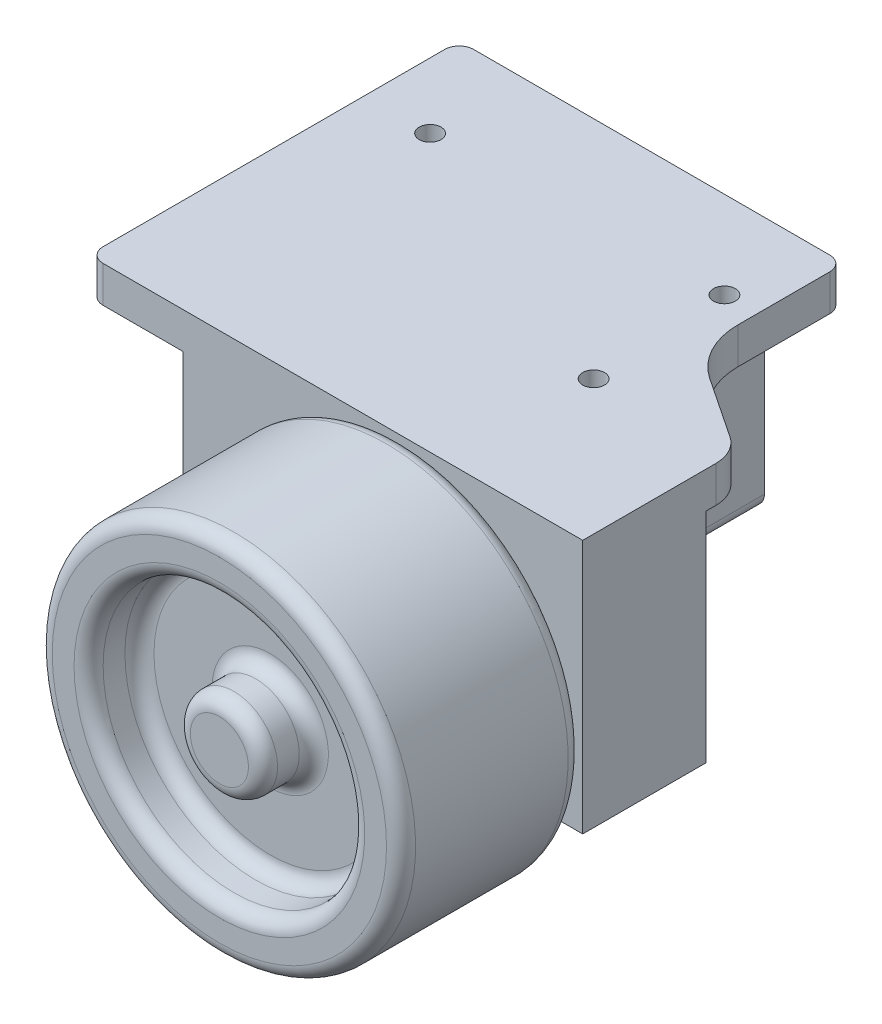
ISO-10303-21;
HEADER;
FILE_DESCRIPTION(('STEP AP214'),'2;1');
FILE_NAME('part.step','',(''),(''),'','','');
FILE_SCHEMA(('AUTOMOTIVE_DESIGN { 1 0 10303 214 1 1 1 1 }'));
ENDSEC;
DATA;
#1=APPLICATION_CONTEXT('core data for automotive mechanical design processes');
#2=APPLICATION_PROTOCOL_DEFINITION('international standard','automotive_design',2000,#1);
#3=PRODUCT_CONTEXT('',#1,'mechanical');
#4=PRODUCT('Part','Part','',(#3));
#5=PRODUCT_RELATED_PRODUCT_CATEGORY('part','',(#4));
#6=PRODUCT_DEFINITION_FORMATION('','',#4);
#7=PRODUCT_DEFINITION_CONTEXT('part definition',#1,'design');
#8=PRODUCT_DEFINITION('design','',#6,#7);
#9=PRODUCT_DEFINITION_SHAPE('','',#8);
#10=(LENGTH_UNIT() NAMED_UNIT(*) SI_UNIT(.MILLI.,.METRE.));
#11=(NAMED_UNIT(*) PLANE_ANGLE_UNIT() SI_UNIT($,.RADIAN.));
#12=(NAMED_UNIT(*) SI_UNIT($,.STERADIAN.) SOLID_ANGLE_UNIT());
#13=UNCERTAINTY_MEASURE_WITH_UNIT(LENGTH_MEASURE(1.E-05),#10,'distance_accuracy_value','');
#14=(GEOMETRIC_REPRESENTATION_CONTEXT(3) GLOBAL_UNCERTAINTY_ASSIGNED_CONTEXT((#13)) GLOBAL_UNIT_ASSIGNED_CONTEXT((#10,
#11,#12)) REPRESENTATION_CONTEXT('',''));
#15=CARTESIAN_POINT('',(0.,0.,0.));
#16=DIRECTION('',(0.,0.,1.));
#17=DIRECTION('',(1.,0.,0.));
#18=AXIS2_PLACEMENT_3D('',#15,#16,#17);
#19=CARTESIAN_POINT('',(0.,0.,-51.));
#20=DIRECTION('',(1.,0.,0.));
#21=DIRECTION('',(0.,0.,1.));
#22=AXIS2_PLACEMENT_3D('',#19,#20,#21);
#23=PLANE('',#22);
#24=DIRECTION('',(0.,0.,1.));
#25=VECTOR('',#24,1.);
#26=CARTESIAN_POINT('',(0.,30.,-51.));
#27=LINE('',#26,#25);
#28=CARTESIAN_POINT('',(0.,30.,-49.));
#29=VERTEX_POINT('',#28);
#30=CARTESIAN_POINT('',(0.,30.,-2.));
#31=VERTEX_POINT('',#30);
#32=EDGE_CURVE('E202',#29,#31,#27,.T.);
#33=ORIENTED_EDGE('',*,*,#32,.T.);
#34=DIRECTION('',(0.,-1.,0.));
#35=VECTOR('',#34,1.);
#36=CARTESIAN_POINT('',(0.,30.,-2.));
#37=LINE('',#36,#35);
#38=CARTESIAN_POINT('',(0.,35.,-2.));
#39=VERTEX_POINT('',#38);
#40=EDGE_CURVE('E364',#39,#31,#37,.T.);
#41=ORIENTED_EDGE('',*,*,#40,.F.);
#42=DIRECTION('',(0.,0.,1.));
#43=VECTOR('',#42,1.);
#44=CARTESIAN_POINT('',(0.,35.,-51.));
#45=LINE('',#44,#43);
#46=CARTESIAN_POINT('',(0.,35.,-49.));
#47=VERTEX_POINT('',#46);
#48=EDGE_CURVE('E273',#47,#39,#45,.T.);
#49=ORIENTED_EDGE('',*,*,#48,.F.);
#50=DIRECTION('',(0.,-1.,0.));
#51=VECTOR('',#50,1.);
#52=CARTESIAN_POINT('',(0.,0.,-49.));
#53=LINE('',#52,#51);
#54=EDGE_CURVE('E367',#29,#47,#53,.F.);
#55=ORIENTED_EDGE('',*,*,#54,.F.);
#56=EDGE_LOOP('',(#33,#41,#49,#55));
#57=FACE_BOUND('',#56,.T.);
#58=ADVANCED_FACE('F39',(#57),#23,.F.);
#59=CARTESIAN_POINT('',(0.,0.,0.));
#60=DIRECTION('',(0.,0.,1.));
#61=DIRECTION('',(-1.,0.,0.));
#62=AXIS2_PLACEMENT_3D('',#59,#60,#61);
#63=PLANE('',#62);
#64=DIRECTION('',(1.,0.,0.));
#65=VECTOR('',#64,1.);
#66=CARTESIAN_POINT('',(0.,30.,0.));
#67=LINE('',#66,#65);
#68=CARTESIAN_POINT('',(2.,30.,0.));
#69=VERTEX_POINT('',#68);
#70=CARTESIAN_POINT('',(13.,30.,0.));
#71=VERTEX_POINT('',#70);
#72=EDGE_CURVE('E180',#69,#71,#67,.T.);
#73=ORIENTED_EDGE('',*,*,#72,.T.);
#74=DIRECTION('',(0.,-1.,0.));
#75=VECTOR('',#74,1.);
#76=CARTESIAN_POINT('',(13.,30.,0.));
#77=LINE('',#76,#75);
#78=CARTESIAN_POINT('',(13.,0.,0.));
#79=VERTEX_POINT('',#78);
#80=EDGE_CURVE('E188',#71,#79,#77,.T.);
#81=ORIENTED_EDGE('',*,*,#80,.T.);
#82=DIRECTION('',(1.,0.,0.));
#83=VECTOR('',#82,1.);
#84=CARTESIAN_POINT('',(0.,0.,0.));
#85=LINE('',#84,#83);
#86=CARTESIAN_POINT('',(68.,0.,0.));
#87=VERTEX_POINT('',#86);
#88=EDGE_CURVE('E263',#79,#87,#85,.T.);
#89=ORIENTED_EDGE('',*,*,#88,.T.);
#90=DIRECTION('',(0.,1.,0.));
#91=VECTOR('',#90,1.);
#92=CARTESIAN_POINT('',(68.,0.,0.));
#93=LINE('',#92,#91);
#94=CARTESIAN_POINT('',(68.,35.,0.));
#95=VERTEX_POINT('',#94);
#96=EDGE_CURVE('E275',#87,#95,#93,.T.);
#97=ORIENTED_EDGE('',*,*,#96,.T.);
#98=DIRECTION('',(-1.,0.,0.));
#99=VECTOR('',#98,1.);
#100=CARTESIAN_POINT('',(0.,35.,0.));
#101=LINE('',#100,#99);
#102=CARTESIAN_POINT('',(2.,35.,0.));
#103=VERTEX_POINT('',#102);
#104=EDGE_CURVE('E270',#95,#103,#101,.T.);
#105=ORIENTED_EDGE('',*,*,#104,.T.);
#106=DIRECTION('',(0.,-1.,0.));
#107=VECTOR('',#106,1.);
#108=CARTESIAN_POINT('',(2.,35.,0.));
#109=LINE('',#108,#107);
#110=EDGE_CURVE('E12',#69,#103,#109,.F.);
#111=ORIENTED_EDGE('',*,*,#110,.F.);
#112=EDGE_LOOP('',(#73,#81,#89,#97,#105,#111));
#113=FACE_BOUND('',#112,.T.);
#114=CARTESIAN_POINT('',(50.,17.,0.));
#115=DIRECTION('',(0.,0.,-1.));
#116=DIRECTION('',(-1.,0.,0.));
#117=AXIS2_PLACEMENT_3D('',#114,#115,#116);
#118=CIRCLE('',#117,6.);
#119=CARTESIAN_POINT('',(44.,17.,0.));
#120=VERTEX_POINT('',#119);
#121=EDGE_CURVE('E259',#120,#120,#118,.T.);
#122=ORIENTED_EDGE('',*,*,#121,.T.);
#123=EDGE_LOOP('',(#122));
#124=FACE_BOUND('',#123,.T.);
#125=ADVANCED_FACE('F199',(#113,#124),#63,.T.);
#126=CARTESIAN_POINT('',(0.,0.,-51.));
#127=DIRECTION('',(0.,1.,0.));
#128=DIRECTION('',(0.,0.,-1.));
#129=AXIS2_PLACEMENT_3D('',#126,#127,#128);
#130=PLANE('',#129);
#131=DIRECTION('',(1.,0.,0.));
#132=VECTOR('',#131,1.);
#133=CARTESIAN_POINT('',(68.,0.,-17.));
#134=LINE('',#133,#132);
#135=CARTESIAN_POINT('',(40.,0.,-17.));
#136=VERTEX_POINT('',#135);
#137=CARTESIAN_POINT('',(68.,0.,-17.));
#138=VERTEX_POINT('',#137);
#139=EDGE_CURVE('E218',#136,#138,#134,.T.);
#140=ORIENTED_EDGE('',*,*,#139,.T.);
#141=DIRECTION('',(0.,0.,1.));
#142=VECTOR('',#141,1.);
#143=CARTESIAN_POINT('',(68.,0.,-51.));
#144=LINE('',#143,#142);
#145=EDGE_CURVE('E283',#138,#87,#144,.T.);
#146=ORIENTED_EDGE('',*,*,#145,.T.);
#147=ORIENTED_EDGE('',*,*,#88,.F.);
#148=DIRECTION('',(0.,0.,-1.));
#149=VECTOR('',#148,1.);
#150=CARTESIAN_POINT('',(13.,0.,0.));
#151=LINE('',#150,#149);
#152=CARTESIAN_POINT('',(13.,0.,-14.));
#153=VERTEX_POINT('',#152);
#154=EDGE_CURVE('E191',#79,#153,#151,.T.);
#155=ORIENTED_EDGE('',*,*,#154,.T.);
#156=DIRECTION('',(0.,0.,-1.));
#157=VECTOR('',#156,1.);
#158=CARTESIAN_POINT('',(13.,0.,-51.));
#159=LINE('',#158,#157);
#160=CARTESIAN_POINT('',(13.,0.,-51.));
#161=VERTEX_POINT('',#160);
#162=EDGE_CURVE('E340',#161,#153,#159,.F.);
#163=ORIENTED_EDGE('',*,*,#162,.F.);
#164=DIRECTION('',(1.,0.,0.));
#165=VECTOR('',#164,1.);
#166=CARTESIAN_POINT('',(0.,0.,-51.));
#167=LINE('',#166,#165);
#168=CARTESIAN_POINT('',(40.,0.,-51.));
#169=VERTEX_POINT('',#168);
#170=EDGE_CURVE('E266',#161,#169,#167,.T.);
#171=ORIENTED_EDGE('',*,*,#170,.T.);
#172=DIRECTION('',(0.,0.,1.));
#173=VECTOR('',#172,1.);
#174=CARTESIAN_POINT('',(40.,0.,-51.));
#175=LINE('',#174,#173);
#176=EDGE_CURVE('E347',#136,#169,#175,.F.);
#177=ORIENTED_EDGE('',*,*,#176,.F.);
#178=EDGE_LOOP('',(#140,#146,#147,#155,#163,#171,#177));
#179=FACE_BOUND('',#178,.T.);
#180=ADVANCED_FACE('F458',(#179),#130,.F.);
#181=CARTESIAN_POINT('',(68.,0.,-51.));
#182=DIRECTION('',(-1.,0.,0.));
#183=DIRECTION('',(0.,0.,-1.));
#184=AXIS2_PLACEMENT_3D('',#181,#182,#183);
#185=PLANE('',#184);
#186=DIRECTION('',(0.,0.,-1.));
#187=VECTOR('',#186,1.);
#188=CARTESIAN_POINT('',(68.,30.,-51.));
#189=LINE('',#188,#187);
#190=CARTESIAN_POINT('',(68.,30.,-17.));
#191=VERTEX_POINT('',#190);
#192=CARTESIAN_POINT('',(68.,30.,-18.32408120756));
#193=VERTEX_POINT('',#192);
#194=EDGE_CURVE('E223',#191,#193,#189,.T.);
#195=ORIENTED_EDGE('',*,*,#194,.T.);
#196=DIRECTION('',(0.,-1.,0.));
#197=VECTOR('',#196,1.);
#198=CARTESIAN_POINT('',(68.,0.,-18.32408120756));
#199=LINE('',#198,#197);
#200=CARTESIAN_POINT('',(68.,35.,-18.32408120756));
#201=VERTEX_POINT('',#200);
#202=EDGE_CURVE('E327',#201,#193,#199,.T.);
#203=ORIENTED_EDGE('',*,*,#202,.F.);
#204=DIRECTION('',(0.,0.,1.));
#205=VECTOR('',#204,1.);
#206=CARTESIAN_POINT('',(68.,35.,-51.));
#207=LINE('',#206,#205);
#208=EDGE_CURVE('E281',#201,#95,#207,.T.);
#209=ORIENTED_EDGE('',*,*,#208,.T.);
#210=ORIENTED_EDGE('',*,*,#96,.F.);
#211=ORIENTED_EDGE('',*,*,#145,.F.);
#212=DIRECTION('',(0.,-1.,0.));
#213=VECTOR('',#212,1.);
#214=CARTESIAN_POINT('',(68.,30.,-17.));
#215=LINE('',#214,#213);
#216=EDGE_CURVE('E237',#191,#138,#215,.T.);
#217=ORIENTED_EDGE('',*,*,#216,.F.);
#218=EDGE_LOOP('',(#195,#203,#209,#210,#211,#217));
#219=FACE_BOUND('',#218,.T.);
#220=ADVANCED_FACE('F410',(#219),#185,.F.);
#221=CARTESIAN_POINT('',(0.,35.,-51.));
#222=DIRECTION('',(0.,-1.,0.));
#223=DIRECTION('',(0.,0.,1.));
#224=AXIS2_PLACEMENT_3D('',#221,#222,#223);
#225=PLANE('',#224);
#226=CARTESIAN_POINT('',(9.00000000000001,35.,-38.));
#227=DIRECTION('',(0.,1.,0.));
#228=DIRECTION('',(0.,0.,1.));
#229=AXIS2_PLACEMENT_3D('',#226,#227,#228);
#230=CIRCLE('',#229,1.5);
#231=CARTESIAN_POINT('',(9.00000000000001,35.,-36.5));
#232=VERTEX_POINT('',#231);
#233=EDGE_CURVE('E391',#232,#232,#230,.T.);
#234=ORIENTED_EDGE('',*,*,#233,.F.);
#235=EDGE_LOOP('',(#234));
#236=FACE_BOUND('',#235,.T.);
#237=CARTESIAN_POINT('',(49.5,35.,-20.));
#238=DIRECTION('',(0.,1.,0.));
#239=DIRECTION('',(0.,0.,1.));
#240=AXIS2_PLACEMENT_3D('',#237,#238,#239);
#241=CIRCLE('',#240,1.5);
#242=CARTESIAN_POINT('',(49.5,35.,-18.5));
#243=VERTEX_POINT('',#242);
#244=EDGE_CURVE('E386',#243,#243,#241,.T.);
#245=ORIENTED_EDGE('',*,*,#244,.F.);
#246=EDGE_LOOP('',(#245));
#247=FACE_BOUND('',#246,.T.);
#248=CARTESIAN_POINT('',(48.5,35.,-39.));
#249=DIRECTION('',(0.,1.,0.));
#250=DIRECTION('',(0.,0.,1.));
#251=AXIS2_PLACEMENT_3D('',#248,#249,#250);
#252=CIRCLE('',#251,1.5);
#253=CARTESIAN_POINT('',(48.5,35.,-37.5));
#254=VERTEX_POINT('',#253);
#255=EDGE_CURVE('E379',#254,#254,#252,.T.);
#256=ORIENTED_EDGE('',*,*,#255,.F.);
#257=EDGE_LOOP('',(#256));
#258=FACE_BOUND('',#257,.T.);
#259=ORIENTED_EDGE('',*,*,#48,.T.);
#260=CARTESIAN_POINT('',(2.,35.,-2.));
#261=DIRECTION('',(0.,1.,0.));
#262=DIRECTION('',(0.,0.,1.));
#263=AXIS2_PLACEMENT_3D('',#260,#261,#262);
#264=CIRCLE('',#263,2.);
#265=EDGE_CURVE('E370',#103,#39,#264,.F.);
#266=ORIENTED_EDGE('',*,*,#265,.F.);
#267=ORIENTED_EDGE('',*,*,#104,.F.);
#268=ORIENTED_EDGE('',*,*,#208,.F.);
#269=CARTESIAN_POINT('',(63.,35.,-18.32408120756));
#270=DIRECTION('',(0.,1.,0.));
#271=DIRECTION('',(0.,0.,1.));
#272=AXIS2_PLACEMENT_3D('',#269,#270,#271);
#273=CIRCLE('',#272,5.);
#274=CARTESIAN_POINT('',(65.7735009811262,35.,-22.4843326792492));
#275=VERTEX_POINT('',#274);
#276=EDGE_CURVE('E332',#275,#201,#273,.F.);
#277=ORIENTED_EDGE('',*,*,#276,.F.);
#278=DIRECTION('',(0.832050294337844,0.,0.554700196225229));
#279=VECTOR('',#278,1.);
#280=CARTESIAN_POINT('',(7.07692307692307,35.,-61.6153846153846));
#281=LINE('',#280,#279);
#282=CARTESIAN_POINT('',(57.4529980377478,35.,-28.0313346415015));
#283=VERTEX_POINT('',#282);
#284=EDGE_CURVE('E324',#283,#275,#281,.T.);
#285=ORIENTED_EDGE('',*,*,#284,.F.);
#286=CARTESIAN_POINT('',(63.,35.,-36.35183758488));
#287=DIRECTION('',(0.,1.,0.));
#288=DIRECTION('',(0.,0.,1.));
#289=AXIS2_PLACEMENT_3D('',#286,#287,#288);
#290=CIRCLE('',#289,10.);
#291=CARTESIAN_POINT('',(53.,35.,-36.35183758488));
#292=VERTEX_POINT('',#291);
#293=EDGE_CURVE('E321',#292,#283,#290,.T.);
#294=ORIENTED_EDGE('',*,*,#293,.F.);
#295=DIRECTION('',(0.,0.,1.));
#296=VECTOR('',#295,1.);
#297=CARTESIAN_POINT('',(53.,35.,-51.));
#298=LINE('',#297,#296);
#299=CARTESIAN_POINT('',(53.,35.,-49.));
#300=VERTEX_POINT('',#299);
#301=EDGE_CURVE('E255',#300,#292,#298,.T.);
#302=ORIENTED_EDGE('',*,*,#301,.F.);
#303=CARTESIAN_POINT('',(51.,35.,-49.));
#304=DIRECTION('',(0.,1.,0.));
#305=DIRECTION('',(0.,0.,1.));
#306=AXIS2_PLACEMENT_3D('',#303,#304,#305);
#307=CIRCLE('',#306,2.);
#308=CARTESIAN_POINT('',(51.,35.,-51.));
#309=VERTEX_POINT('',#308);
#310=EDGE_CURVE('E372',#309,#300,#307,.F.);
#311=ORIENTED_EDGE('',*,*,#310,.F.);
#312=DIRECTION('',(-1.,0.,0.));
#313=VECTOR('',#312,1.);
#314=CARTESIAN_POINT('',(0.,35.,-51.));
#315=LINE('',#314,#313);
#316=CARTESIAN_POINT('',(2.,35.,-51.));
#317=VERTEX_POINT('',#316);
#318=EDGE_CURVE('E269',#309,#317,#315,.T.);
#319=ORIENTED_EDGE('',*,*,#318,.T.);
#320=CARTESIAN_POINT('',(2.,35.,-49.));
#321=DIRECTION('',(0.,1.,0.));
#322=DIRECTION('',(0.,0.,1.));
#323=AXIS2_PLACEMENT_3D('',#320,#321,#322);
#324=CIRCLE('',#323,2.);
#325=EDGE_CURVE('E374',#47,#317,#324,.F.);
#326=ORIENTED_EDGE('',*,*,#325,.F.);
#327=EDGE_LOOP('',(#259,#266,#267,#268,#277,#285,#294,#302,#311,#319,#326));
#328=FACE_BOUND('',#327,.T.);
#329=ADVANCED_FACE('F406',(#236,#247,#258,#328),#225,.F.);
#330=CARTESIAN_POINT('',(0.,0.,-51.));
#331=DIRECTION('',(0.,0.,1.));
#332=DIRECTION('',(-1.,0.,0.));
#333=AXIS2_PLACEMENT_3D('',#330,#331,#332);
#334=PLANE('',#333);
#335=ORIENTED_EDGE('',*,*,#318,.F.);
#336=DIRECTION('',(0.,1.,0.));
#337=VECTOR('',#336,1.);
#338=CARTESIAN_POINT('',(51.,0.,-51.));
#339=LINE('',#338,#337);
#340=CARTESIAN_POINT('',(51.,30.,-51.));
#341=VERTEX_POINT('',#340);
#342=EDGE_CURVE('E355',#341,#309,#339,.T.);
#343=ORIENTED_EDGE('',*,*,#342,.F.);
#344=DIRECTION('',(-1.,0.,0.));
#345=VECTOR('',#344,1.);
#346=CARTESIAN_POINT('',(68.,30.,-51.));
#347=LINE('',#346,#345);
#348=CARTESIAN_POINT('',(42.,30.,-51.));
#349=VERTEX_POINT('',#348);
#350=EDGE_CURVE('E226',#341,#349,#347,.T.);
#351=ORIENTED_EDGE('',*,*,#350,.T.);
#352=DIRECTION('',(0.,-1.,0.));
#353=VECTOR('',#352,1.);
#354=CARTESIAN_POINT('',(42.,30.,-51.));
#355=LINE('',#354,#353);
#356=CARTESIAN_POINT('',(42.,2.,-51.));
#357=VERTEX_POINT('',#356);
#358=EDGE_CURVE('E234',#349,#357,#355,.T.);
#359=ORIENTED_EDGE('',*,*,#358,.T.);
#360=CARTESIAN_POINT('',(40.,2.,-51.));
#361=DIRECTION('',(0.,0.,-1.));
#362=DIRECTION('',(-1.,0.,0.));
#363=AXIS2_PLACEMENT_3D('',#360,#361,#362);
#364=CIRCLE('',#363,2.);
#365=EDGE_CURVE('E350',#169,#357,#364,.F.);
#366=ORIENTED_EDGE('',*,*,#365,.F.);
#367=ORIENTED_EDGE('',*,*,#170,.F.);
#368=CARTESIAN_POINT('',(13.,8.,-51.));
#369=DIRECTION('',(0.,0.,-1.));
#370=DIRECTION('',(-1.,0.,0.));
#371=AXIS2_PLACEMENT_3D('',#368,#369,#370);
#372=CIRCLE('',#371,8.);
#373=CARTESIAN_POINT('',(5.,8.,-51.));
#374=VERTEX_POINT('',#373);
#375=EDGE_CURVE('E338',#374,#161,#372,.F.);
#376=ORIENTED_EDGE('',*,*,#375,.F.);
#377=DIRECTION('',(0.,-1.,0.));
#378=VECTOR('',#377,1.);
#379=CARTESIAN_POINT('',(5.,30.,-51.));
#380=LINE('',#379,#378);
#381=CARTESIAN_POINT('',(5.,30.,-51.));
#382=VERTEX_POINT('',#381);
#383=EDGE_CURVE('E215',#382,#374,#380,.T.);
#384=ORIENTED_EDGE('',*,*,#383,.F.);
#385=DIRECTION('',(-1.,0.,0.));
#386=VECTOR('',#385,1.);
#387=CARTESIAN_POINT('',(5.,30.,-51.));
#388=LINE('',#387,#386);
#389=CARTESIAN_POINT('',(2.,30.,-51.));
#390=VERTEX_POINT('',#389);
#391=EDGE_CURVE('E196',#382,#390,#388,.T.);
#392=ORIENTED_EDGE('',*,*,#391,.T.);
#393=DIRECTION('',(0.,-1.,0.));
#394=VECTOR('',#393,1.);
#395=CARTESIAN_POINT('',(2.,0.,-51.));
#396=LINE('',#395,#394);
#397=EDGE_CURVE('E357',#317,#390,#396,.T.);
#398=ORIENTED_EDGE('',*,*,#397,.F.);
#399=EDGE_LOOP('',(#335,#343,#351,#359,#366,#367,#376,#384,#392,#398));
#400=FACE_BOUND('',#399,.T.);
#401=ADVANCED_FACE('F409',(#400),#334,.F.);
#402=CARTESIAN_POINT('',(50.,17.,7.));
#403=DIRECTION('',(0.,0.,-1.));
#404=DIRECTION('',(1.,0.,0.));
#405=AXIS2_PLACEMENT_3D('',#402,#403,#404);
#406=CYLINDRICAL_SURFACE('',#405,6.);
#407=CARTESIAN_POINT('',(50.,17.,7.));
#408=DIRECTION('',(0.,0.,-1.));
#409=DIRECTION('',(-1.,0.,0.));
#410=AXIS2_PLACEMENT_3D('',#407,#408,#409);
#411=CIRCLE('',#410,6.);
#412=CARTESIAN_POINT('',(44.,17.,7.));
#413=VERTEX_POINT('',#412);
#414=EDGE_CURVE('E260',#413,#413,#411,.T.);
#415=ORIENTED_EDGE('',*,*,#414,.T.);
#416=EDGE_LOOP('',(#415));
#417=FACE_BOUND('',#416,.T.);
#418=ORIENTED_EDGE('',*,*,#121,.F.);
#419=EDGE_LOOP('',(#418));
#420=FACE_BOUND('',#419,.T.);
#421=ADVANCED_FACE('F688',(#417,#420),#406,.T.);
#422=CARTESIAN_POINT('',(50.,17.,7.));
#423=DIRECTION('',(0.,0.,1.));
#424=DIRECTION('',(-1.,0.,0.));
#425=AXIS2_PLACEMENT_3D('',#422,#423,#424);
#426=PLANE('',#425);
#427=CARTESIAN_POINT('',(50.,17.,7.));
#428=DIRECTION('',(0.,0.,-1.));
#429=DIRECTION('',(-1.,0.,0.));
#430=AXIS2_PLACEMENT_3D('',#427,#428,#429);
#431=CIRCLE('',#430,23.);
#432=CARTESIAN_POINT('',(27.,17.,7.));
#433=VERTEX_POINT('',#432);
#434=EDGE_CURVE('E312',#433,#433,#431,.F.);
#435=ORIENTED_EDGE('',*,*,#434,.F.);
#436=EDGE_LOOP('',(#435));
#437=FACE_BOUND('',#436,.T.);
#438=ORIENTED_EDGE('',*,*,#414,.F.);
#439=EDGE_LOOP('',(#438));
#440=FACE_BOUND('',#439,.T.);
#441=ADVANCED_FACE('F696',(#437,#440),#426,.F.);
#442=CARTESIAN_POINT('',(50.,17.,32.));
#443=DIRECTION('',(0.,0.,-1.));
#444=DIRECTION('',(1.,0.,0.));
#445=AXIS2_PLACEMENT_3D('',#442,#443,#444);
#446=CYLINDRICAL_SURFACE('',#445,25.);
#447=CARTESIAN_POINT('',(50.,17.,30.));
#448=DIRECTION('',(0.,0.,-1.));
#449=DIRECTION('',(-1.,0.,0.));
#450=AXIS2_PLACEMENT_3D('',#447,#448,#449);
#451=CIRCLE('',#450,25.);
#452=CARTESIAN_POINT('',(25.,17.,30.));
#453=VERTEX_POINT('',#452);
#454=EDGE_CURVE('E294',#453,#453,#451,.F.);
#455=ORIENTED_EDGE('',*,*,#454,.F.);
#456=EDGE_LOOP('',(#455));
#457=FACE_BOUND('',#456,.T.);
#458=CARTESIAN_POINT('',(50.,17.,9.));
#459=DIRECTION('',(0.,0.,-1.));
#460=DIRECTION('',(-1.,0.,0.));
#461=AXIS2_PLACEMENT_3D('',#458,#459,#460);
#462=CIRCLE('',#461,25.);
#463=CARTESIAN_POINT('',(25.,17.,9.));
#464=VERTEX_POINT('',#463);
#465=EDGE_CURVE('E291',#464,#464,#462,.T.);
#466=ORIENTED_EDGE('',*,*,#465,.F.);
#467=EDGE_LOOP('',(#466));
#468=FACE_BOUND('',#467,.T.);
#469=ADVANCED_FACE('F705',(#457,#468),#446,.T.);
#470=CARTESIAN_POINT('',(50.,17.,32.));
#471=DIRECTION('',(0.,0.,1.));
#472=DIRECTION('',(-1.,0.,0.));
#473=AXIS2_PLACEMENT_3D('',#470,#471,#472);
#474=PLANE('',#473);
#475=CARTESIAN_POINT('',(50.,17.,32.));
#476=DIRECTION('',(0.,0.,-1.));
#477=DIRECTION('',(-1.,0.,0.));
#478=AXIS2_PLACEMENT_3D('',#475,#476,#477);
#479=CIRCLE('',#478,23.);
#480=CARTESIAN_POINT('',(27.,17.,32.));
#481=VERTEX_POINT('',#480);
#482=EDGE_CURVE('E288',#481,#481,#479,.T.);
#483=ORIENTED_EDGE('',*,*,#482,.F.);
#484=EDGE_LOOP('',(#483));
#485=FACE_BOUND('',#484,.T.);
#486=CARTESIAN_POINT('',(50.,17.,32.));
#487=DIRECTION('',(0.,0.,-1.));
#488=DIRECTION('',(-1.,0.,0.));
#489=AXIS2_PLACEMENT_3D('',#486,#487,#488);
#490=CIRCLE('',#489,20.);
#491=CARTESIAN_POINT('',(30.,17.,32.));
#492=VERTEX_POINT('',#491);
#493=EDGE_CURVE('E285',#492,#492,#490,.F.);
#494=ORIENTED_EDGE('',*,*,#493,.F.);
#495=EDGE_LOOP('',(#494));
#496=FACE_BOUND('',#495,.T.);
#497=ADVANCED_FACE('F712',(#485,#496),#474,.T.);
#498=CARTESIAN_POINT('',(50.,17.,25.));
#499=DIRECTION('',(0.,0.,1.));
#500=DIRECTION('',(-1.,0.,0.));
#501=AXIS2_PLACEMENT_3D('',#498,#499,#500);
#502=CYLINDRICAL_SURFACE('',#501,18.);
#503=CARTESIAN_POINT('',(50.,17.,30.));
#504=DIRECTION('',(0.,0.,-1.));
#505=DIRECTION('',(-1.,0.,0.));
#506=AXIS2_PLACEMENT_3D('',#503,#504,#505);
#507=CIRCLE('',#506,18.);
#508=CARTESIAN_POINT('',(32.,17.,30.));
#509=VERTEX_POINT('',#508);
#510=EDGE_CURVE('E300',#509,#509,#507,.T.);
#511=ORIENTED_EDGE('',*,*,#510,.F.);
#512=EDGE_LOOP('',(#511));
#513=FACE_BOUND('',#512,.T.);
#514=CARTESIAN_POINT('',(50.,17.,27.));
#515=DIRECTION('',(0.,0.,-1.));
#516=DIRECTION('',(-1.,0.,0.));
#517=AXIS2_PLACEMENT_3D('',#514,#515,#516);
#518=CIRCLE('',#517,18.);
#519=CARTESIAN_POINT('',(32.,17.,27.));
#520=VERTEX_POINT('',#519);
#521=EDGE_CURVE('E297',#520,#520,#518,.F.);
#522=ORIENTED_EDGE('',*,*,#521,.F.);
#523=EDGE_LOOP('',(#522));
#524=FACE_BOUND('',#523,.T.);
#525=ADVANCED_FACE('F719',(#513,#524),#502,.F.);
#526=CARTESIAN_POINT('',(50.,17.,25.));
#527=DIRECTION('',(0.,0.,1.));
#528=DIRECTION('',(-1.,0.,0.));
#529=AXIS2_PLACEMENT_3D('',#526,#527,#528);
#530=PLANE('',#529);
#531=CARTESIAN_POINT('',(50.,17.,25.));
#532=DIRECTION('',(0.,0.,-1.));
#533=DIRECTION('',(-1.,0.,0.));
#534=AXIS2_PLACEMENT_3D('',#531,#532,#533);
#535=CIRCLE('',#534,8.);
#536=CARTESIAN_POINT('',(42.,17.,25.));
#537=VERTEX_POINT('',#536);
#538=EDGE_CURVE('E318',#537,#537,#535,.F.);
#539=ORIENTED_EDGE('',*,*,#538,.F.);
#540=EDGE_LOOP('',(#539));
#541=FACE_BOUND('',#540,.T.);
#542=CARTESIAN_POINT('',(50.,17.,25.));
#543=DIRECTION('',(0.,0.,-1.));
#544=DIRECTION('',(-1.,0.,0.));
#545=AXIS2_PLACEMENT_3D('',#542,#543,#544);
#546=CIRCLE('',#545,16.);
#547=CARTESIAN_POINT('',(34.,17.,25.));
#548=VERTEX_POINT('',#547);
#549=EDGE_CURVE('E315',#548,#548,#546,.T.);
#550=ORIENTED_EDGE('',*,*,#549,.F.);
#551=EDGE_LOOP('',(#550));
#552=FACE_BOUND('',#551,.T.);
#553=ADVANCED_FACE('F727',(#541,#552),#530,.T.);
#554=CARTESIAN_POINT('',(50.,17.,25.));
#555=DIRECTION('',(0.,0.,1.));
#556=DIRECTION('',(-1.,0.,0.));
#557=AXIS2_PLACEMENT_3D('',#554,#555,#556);
#558=CYLINDRICAL_SURFACE('',#557,6.);
#559=CARTESIAN_POINT('',(50.,17.,30.));
#560=DIRECTION('',(0.,0.,-1.));
#561=DIRECTION('',(-1.,0.,0.));
#562=AXIS2_PLACEMENT_3D('',#559,#560,#561);
#563=CIRCLE('',#562,6.);
#564=CARTESIAN_POINT('',(44.,17.,30.));
#565=VERTEX_POINT('',#564);
#566=EDGE_CURVE('E309',#565,#565,#563,.F.);
#567=ORIENTED_EDGE('',*,*,#566,.F.);
#568=EDGE_LOOP('',(#567));
#569=FACE_BOUND('',#568,.T.);
#570=CARTESIAN_POINT('',(50.,17.,27.));
#571=DIRECTION('',(0.,0.,-1.));
#572=DIRECTION('',(-1.,0.,0.));
#573=AXIS2_PLACEMENT_3D('',#570,#571,#572);
#574=CIRCLE('',#573,6.);
#575=CARTESIAN_POINT('',(44.,17.,27.));
#576=VERTEX_POINT('',#575);
#577=EDGE_CURVE('E306',#576,#576,#574,.T.);
#578=ORIENTED_EDGE('',*,*,#577,.F.);
#579=EDGE_LOOP('',(#578));
#580=FACE_BOUND('',#579,.T.);
#581=ADVANCED_FACE('F735',(#569,#580),#558,.T.);
#582=CARTESIAN_POINT('',(50.,17.,32.));
#583=DIRECTION('',(0.,0.,-1.));
#584=DIRECTION('',(-1.,0.,0.));
#585=AXIS2_PLACEMENT_3D('',#582,#583,#584);
#586=CIRCLE('',#585,4.);
#587=CARTESIAN_POINT('',(46.,17.,32.));
#588=VERTEX_POINT('',#587);
#589=EDGE_CURVE('E303',#588,#588,#586,.T.);
#590=ORIENTED_EDGE('',*,*,#589,.F.);
#591=EDGE_LOOP('',(#590));
#592=FACE_BOUND('',#591,.T.);
#593=ADVANCED_FACE('F467',(#592),#474,.T.);
#594=CARTESIAN_POINT('',(50.,17.,30.));
#595=DIRECTION('',(0.,0.,1.));
#596=DIRECTION('',(-1.,0.,0.));
#597=AXIS2_PLACEMENT_3D('',#594,#595,#596);
#598=TOROIDAL_SURFACE('',#597,23.,2.);
#599=ORIENTED_EDGE('',*,*,#454,.T.);
#600=EDGE_LOOP('',(#599));
#601=FACE_BOUND('',#600,.T.);
#602=ORIENTED_EDGE('',*,*,#482,.T.);
#603=EDGE_LOOP('',(#602));
#604=FACE_BOUND('',#603,.T.);
#605=ADVANCED_FACE('F463',(#601,#604),#598,.T.);
#606=CARTESIAN_POINT('',(50.,17.,30.));
#607=DIRECTION('',(0.,0.,1.));
#608=DIRECTION('',(-1.,0.,0.));
#609=AXIS2_PLACEMENT_3D('',#606,#607,#608);
#610=TOROIDAL_SURFACE('',#609,20.,2.);
#611=ORIENTED_EDGE('',*,*,#493,.T.);
#612=EDGE_LOOP('',(#611));
#613=FACE_BOUND('',#612,.T.);
#614=ORIENTED_EDGE('',*,*,#510,.T.);
#615=EDGE_LOOP('',(#614));
#616=FACE_BOUND('',#615,.T.);
#617=ADVANCED_FACE('F466',(#613,#616),#610,.T.);
#618=CARTESIAN_POINT('',(50.,17.,30.));
#619=DIRECTION('',(0.,0.,1.));
#620=DIRECTION('',(-1.,0.,0.));
#621=AXIS2_PLACEMENT_3D('',#618,#619,#620);
#622=TOROIDAL_SURFACE('',#621,4.,2.);
#623=ORIENTED_EDGE('',*,*,#566,.T.);
#624=EDGE_LOOP('',(#623));
#625=FACE_BOUND('',#624,.T.);
#626=ORIENTED_EDGE('',*,*,#589,.T.);
#627=EDGE_LOOP('',(#626));
#628=FACE_BOUND('',#627,.T.);
#629=ADVANCED_FACE('F471',(#625,#628),#622,.T.);
#630=CARTESIAN_POINT('',(50.,17.,9.));
#631=DIRECTION('',(0.,0.,1.));
#632=DIRECTION('',(-1.,0.,0.));
#633=AXIS2_PLACEMENT_3D('',#630,#631,#632);
#634=TOROIDAL_SURFACE('',#633,23.,2.);
#635=ORIENTED_EDGE('',*,*,#434,.T.);
#636=EDGE_LOOP('',(#635));
#637=FACE_BOUND('',#636,.T.);
#638=ORIENTED_EDGE('',*,*,#465,.T.);
#639=EDGE_LOOP('',(#638));
#640=FACE_BOUND('',#639,.T.);
#641=ADVANCED_FACE('F475',(#637,#640),#634,.T.);
#642=CARTESIAN_POINT('',(50.,17.,27.));
#643=DIRECTION('',(0.,0.,1.));
#644=DIRECTION('',(-1.,0.,0.));
#645=AXIS2_PLACEMENT_3D('',#642,#643,#644);
#646=TOROIDAL_SURFACE('',#645,8.,2.);
#647=ORIENTED_EDGE('',*,*,#538,.T.);
#648=EDGE_LOOP('',(#647));
#649=FACE_BOUND('',#648,.T.);
#650=ORIENTED_EDGE('',*,*,#577,.T.);
#651=EDGE_LOOP('',(#650));
#652=FACE_BOUND('',#651,.T.);
#653=ADVANCED_FACE('F479',(#649,#652),#646,.F.);
#654=CARTESIAN_POINT('',(50.,17.,27.));
#655=DIRECTION('',(0.,0.,1.));
#656=DIRECTION('',(-1.,0.,0.));
#657=AXIS2_PLACEMENT_3D('',#654,#655,#656);
#658=TOROIDAL_SURFACE('',#657,16.,2.);
#659=ORIENTED_EDGE('',*,*,#521,.T.);
#660=EDGE_LOOP('',(#659));
#661=FACE_BOUND('',#660,.T.);
#662=ORIENTED_EDGE('',*,*,#549,.T.);
#663=EDGE_LOOP('',(#662));
#664=FACE_BOUND('',#663,.T.);
#665=ADVANCED_FACE('F483',(#661,#664),#658,.F.);
#666=CARTESIAN_POINT('',(57.4529980377478,42.,-28.0313346415015));
#667=DIRECTION('',(-0.554700196225229,0.,0.832050294337844));
#668=DIRECTION('',(-0.832050294337844,0.,-0.554700196225229));
#669=AXIS2_PLACEMENT_3D('',#666,#667,#668);
#670=PLANE('',#669);
#671=DIRECTION('',(0.,-1.,0.));
#672=VECTOR('',#671,1.);
#673=CARTESIAN_POINT('',(57.4529980377478,42.,-28.0313346415015));
#674=LINE('',#673,#672);
#675=CARTESIAN_POINT('',(57.4529980377478,30.,-28.0313346415015));
#676=VERTEX_POINT('',#675);
#677=EDGE_CURVE('E252',#283,#676,#674,.T.);
#678=ORIENTED_EDGE('',*,*,#677,.F.);
#679=ORIENTED_EDGE('',*,*,#284,.T.);
#680=DIRECTION('',(0.,-1.,0.));
#681=VECTOR('',#680,1.);
#682=CARTESIAN_POINT('',(65.7735009811261,42.,-22.4843326792492));
#683=LINE('',#682,#681);
#684=CARTESIAN_POINT('',(65.7735009811262,30.,-22.4843326792492));
#685=VERTEX_POINT('',#684);
#686=EDGE_CURVE('E330',#685,#275,#683,.F.);
#687=ORIENTED_EDGE('',*,*,#686,.F.);
#688=DIRECTION('',(0.832050294337844,0.,0.554700196225229));
#689=VECTOR('',#688,1.);
#690=CARTESIAN_POINT('',(57.4529980377478,30.,-28.0313346415015));
#691=LINE('',#690,#689);
#692=EDGE_CURVE('E239',#676,#685,#691,.T.);
#693=ORIENTED_EDGE('',*,*,#692,.F.);
#694=EDGE_LOOP('',(#678,#679,#687,#693));
#695=FACE_BOUND('',#694,.T.);
#696=ADVANCED_FACE('F435',(#695),#670,.F.);
#697=CARTESIAN_POINT('',(63.,42.,-36.35183758488));
#698=DIRECTION('',(0.,-1.,0.));
#699=DIRECTION('',(0.,0.,1.));
#700=AXIS2_PLACEMENT_3D('',#697,#698,#699);
#701=CYLINDRICAL_SURFACE('',#700,10.);
#702=DIRECTION('',(0.,-1.,0.));
#703=VECTOR('',#702,1.);
#704=CARTESIAN_POINT('',(53.,42.,-36.35183758488));
#705=LINE('',#704,#703);
#706=CARTESIAN_POINT('',(53.,30.,-36.35183758488));
#707=VERTEX_POINT('',#706);
#708=EDGE_CURVE('E251',#292,#707,#705,.T.);
#709=ORIENTED_EDGE('',*,*,#708,.F.);
#710=ORIENTED_EDGE('',*,*,#293,.T.);
#711=ORIENTED_EDGE('',*,*,#677,.T.);
#712=CARTESIAN_POINT('',(63.,30.,-36.35183758488));
#713=DIRECTION('',(0.,-1.,0.));
#714=DIRECTION('',(0.,0.,-1.));
#715=AXIS2_PLACEMENT_3D('',#712,#713,#714);
#716=CIRCLE('',#715,10.);
#717=EDGE_CURVE('E247',#707,#676,#716,.F.);
#718=ORIENTED_EDGE('',*,*,#717,.F.);
#719=EDGE_LOOP('',(#709,#710,#711,#718));
#720=FACE_BOUND('',#719,.T.);
#721=ADVANCED_FACE('F440',(#720),#701,.F.);
#722=CARTESIAN_POINT('',(53.,42.,-51.));
#723=DIRECTION('',(-1.,0.,0.));
#724=DIRECTION('',(0.,0.,-1.));
#725=AXIS2_PLACEMENT_3D('',#722,#723,#724);
#726=PLANE('',#725);
#727=ORIENTED_EDGE('',*,*,#301,.T.);
#728=ORIENTED_EDGE('',*,*,#708,.T.);
#729=DIRECTION('',(0.,0.,1.));
#730=VECTOR('',#729,1.);
#731=CARTESIAN_POINT('',(53.,30.,-51.));
#732=LINE('',#731,#730);
#733=CARTESIAN_POINT('',(53.,30.,-49.));
#734=VERTEX_POINT('',#733);
#735=EDGE_CURVE('E249',#734,#707,#732,.T.);
#736=ORIENTED_EDGE('',*,*,#735,.F.);
#737=DIRECTION('',(0.,1.,0.));
#738=VECTOR('',#737,1.);
#739=CARTESIAN_POINT('',(53.,42.,-49.));
#740=LINE('',#739,#738);
#741=EDGE_CURVE('E62',#300,#734,#740,.F.);
#742=ORIENTED_EDGE('',*,*,#741,.F.);
#743=EDGE_LOOP('',(#727,#728,#736,#742));
#744=FACE_BOUND('',#743,.T.);
#745=ADVANCED_FACE('F442',(#744),#726,.F.);
#746=CARTESIAN_POINT('',(63.,0.,-18.32408120756));
#747=DIRECTION('',(0.,-1.,0.));
#748=DIRECTION('',(0.,0.,1.));
#749=AXIS2_PLACEMENT_3D('',#746,#747,#748);
#750=CYLINDRICAL_SURFACE('',#749,5.);
#751=CARTESIAN_POINT('',(63.,30.,-18.32408120756));
#752=DIRECTION('',(0.,-1.,0.));
#753=DIRECTION('',(0.,0.,-1.));
#754=AXIS2_PLACEMENT_3D('',#751,#752,#753);
#755=CIRCLE('',#754,5.);
#756=EDGE_CURVE('E334',#193,#685,#755,.F.);
#757=ORIENTED_EDGE('',*,*,#756,.T.);
#758=ORIENTED_EDGE('',*,*,#686,.T.);
#759=ORIENTED_EDGE('',*,*,#276,.T.);
#760=ORIENTED_EDGE('',*,*,#202,.T.);
#761=EDGE_LOOP('',(#757,#758,#759,#760));
#762=FACE_BOUND('',#761,.T.);
#763=ADVANCED_FACE('F431',(#762),#750,.T.);
#764=CARTESIAN_POINT('',(0.,30.,0.));
#765=DIRECTION('',(0.,1.,0.));
#766=DIRECTION('',(0.,0.,-1.));
#767=AXIS2_PLACEMENT_3D('',#764,#765,#766);
#768=PLANE('',#767);
#769=CARTESIAN_POINT('',(49.5,30.,-20.));
#770=DIRECTION('',(0.,1.,0.));
#771=DIRECTION('',(0.,0.,1.));
#772=AXIS2_PLACEMENT_3D('',#769,#770,#771);
#773=CIRCLE('',#772,1.5);
#774=CARTESIAN_POINT('',(49.5,30.,-18.5));
#775=VERTEX_POINT('',#774);
#776=EDGE_CURVE('E43',#775,#775,#773,.T.);
#777=ORIENTED_EDGE('',*,*,#776,.T.);
#778=EDGE_LOOP('',(#777));
#779=FACE_BOUND('',#778,.T.);
#780=CARTESIAN_POINT('',(48.5,30.,-39.));
#781=DIRECTION('',(0.,1.,0.));
#782=DIRECTION('',(0.,0.,1.));
#783=AXIS2_PLACEMENT_3D('',#780,#781,#782);
#784=CIRCLE('',#783,1.5);
#785=CARTESIAN_POINT('',(48.5,30.,-37.5));
#786=VERTEX_POINT('',#785);
#787=EDGE_CURVE('E214',#786,#786,#784,.T.);
#788=ORIENTED_EDGE('',*,*,#787,.T.);
#789=EDGE_LOOP('',(#788));
#790=FACE_BOUND('',#789,.T.);
#791=ORIENTED_EDGE('',*,*,#735,.T.);
#792=ORIENTED_EDGE('',*,*,#717,.T.);
#793=ORIENTED_EDGE('',*,*,#692,.T.);
#794=ORIENTED_EDGE('',*,*,#756,.F.);
#795=ORIENTED_EDGE('',*,*,#194,.F.);
#796=DIRECTION('',(1.,0.,0.));
#797=VECTOR('',#796,1.);
#798=CARTESIAN_POINT('',(68.,30.,-17.));
#799=LINE('',#798,#797);
#800=CARTESIAN_POINT('',(42.,30.,-17.));
#801=VERTEX_POINT('',#800);
#802=EDGE_CURVE('E232',#801,#191,#799,.T.);
#803=ORIENTED_EDGE('',*,*,#802,.F.);
#804=DIRECTION('',(0.,0.,1.));
#805=VECTOR('',#804,1.);
#806=CARTESIAN_POINT('',(42.,30.,-51.));
#807=LINE('',#806,#805);
#808=EDGE_CURVE('E229',#349,#801,#807,.T.);
#809=ORIENTED_EDGE('',*,*,#808,.F.);
#810=ORIENTED_EDGE('',*,*,#350,.F.);
#811=CARTESIAN_POINT('',(51.,30.,-49.));
#812=DIRECTION('',(0.,-1.,0.));
#813=DIRECTION('',(0.,0.,-1.));
#814=AXIS2_PLACEMENT_3D('',#811,#812,#813);
#815=CIRCLE('',#814,2.);
#816=EDGE_CURVE('E48',#734,#341,#815,.F.);
#817=ORIENTED_EDGE('',*,*,#816,.F.);
#818=EDGE_LOOP('',(#791,#792,#793,#794,#795,#803,#809,#810,#817));
#819=FACE_BOUND('',#818,.T.);
#820=ADVANCED_FACE('F449',(#779,#790,#819),#768,.F.);
#821=CARTESIAN_POINT('',(68.,30.,-17.));
#822=DIRECTION('',(0.,0.,1.));
#823=DIRECTION('',(-1.,0.,0.));
#824=AXIS2_PLACEMENT_3D('',#821,#822,#823);
#825=PLANE('',#824);
#826=ORIENTED_EDGE('',*,*,#139,.F.);
#827=CARTESIAN_POINT('',(40.,2.,-17.));
#828=DIRECTION('',(0.,0.,-1.));
#829=DIRECTION('',(-1.,0.,0.));
#830=AXIS2_PLACEMENT_3D('',#827,#828,#829);
#831=CIRCLE('',#830,2.);
#832=CARTESIAN_POINT('',(42.,2.,-17.));
#833=VERTEX_POINT('',#832);
#834=EDGE_CURVE('E353',#833,#136,#831,.T.);
#835=ORIENTED_EDGE('',*,*,#834,.F.);
#836=DIRECTION('',(0.,-1.,0.));
#837=VECTOR('',#836,1.);
#838=CARTESIAN_POINT('',(42.,30.,-17.));
#839=LINE('',#838,#837);
#840=EDGE_CURVE('E240',#801,#833,#839,.T.);
#841=ORIENTED_EDGE('',*,*,#840,.F.);
#842=ORIENTED_EDGE('',*,*,#802,.T.);
#843=ORIENTED_EDGE('',*,*,#216,.T.);
#844=EDGE_LOOP('',(#826,#835,#841,#842,#843));
#845=FACE_BOUND('',#844,.T.);
#846=ADVANCED_FACE('F526',(#845),#825,.F.);
#847=CARTESIAN_POINT('',(42.,30.,-51.));
#848=DIRECTION('',(-1.,0.,0.));
#849=DIRECTION('',(0.,0.,-1.));
#850=AXIS2_PLACEMENT_3D('',#847,#848,#849);
#851=PLANE('',#850);
#852=ORIENTED_EDGE('',*,*,#358,.F.);
#853=ORIENTED_EDGE('',*,*,#808,.T.);
#854=ORIENTED_EDGE('',*,*,#840,.T.);
#855=DIRECTION('',(0.,0.,1.));
#856=VECTOR('',#855,1.);
#857=CARTESIAN_POINT('',(42.,2.,-51.));
#858=LINE('',#857,#856);
#859=EDGE_CURVE('E345',#357,#833,#858,.T.);
#860=ORIENTED_EDGE('',*,*,#859,.F.);
#861=EDGE_LOOP('',(#852,#853,#854,#860));
#862=FACE_BOUND('',#861,.T.);
#863=ADVANCED_FACE('F529',(#862),#851,.F.);
#864=CARTESIAN_POINT('',(5.,30.,-14.));
#865=DIRECTION('',(1.,0.,0.));
#866=DIRECTION('',(0.,0.,1.));
#867=AXIS2_PLACEMENT_3D('',#864,#865,#866);
#868=PLANE('',#867);
#869=DIRECTION('',(0.,-1.,0.));
#870=VECTOR('',#869,1.);
#871=CARTESIAN_POINT('',(5.,30.,-14.));
#872=LINE('',#871,#870);
#873=CARTESIAN_POINT('',(5.,30.,-14.));
#874=VERTEX_POINT('',#873);
#875=CARTESIAN_POINT('',(5.,8.,-14.));
#876=VERTEX_POINT('',#875);
#877=EDGE_CURVE('E219',#874,#876,#872,.T.);
#878=ORIENTED_EDGE('',*,*,#877,.F.);
#879=DIRECTION('',(0.,0.,-1.));
#880=VECTOR('',#879,1.);
#881=CARTESIAN_POINT('',(5.,30.,-14.));
#882=LINE('',#881,#880);
#883=EDGE_CURVE('E209',#874,#382,#882,.T.);
#884=ORIENTED_EDGE('',*,*,#883,.T.);
#885=ORIENTED_EDGE('',*,*,#383,.T.);
#886=DIRECTION('',(0.,0.,-1.));
#887=VECTOR('',#886,1.);
#888=CARTESIAN_POINT('',(5.,8.,-14.));
#889=LINE('',#888,#887);
#890=EDGE_CURVE('E336',#876,#374,#889,.T.);
#891=ORIENTED_EDGE('',*,*,#890,.F.);
#892=EDGE_LOOP('',(#878,#884,#885,#891));
#893=FACE_BOUND('',#892,.T.);
#894=ADVANCED_FACE('F517',(#893),#868,.F.);
#895=CARTESIAN_POINT('',(13.,30.,-14.));
#896=DIRECTION('',(0.,0.,-1.));
#897=DIRECTION('',(1.,0.,0.));
#898=AXIS2_PLACEMENT_3D('',#895,#896,#897);
#899=PLANE('',#898);
#900=DIRECTION('',(0.,-1.,0.));
#901=VECTOR('',#900,1.);
#902=CARTESIAN_POINT('',(13.,30.,-14.));
#903=LINE('',#902,#901);
#904=CARTESIAN_POINT('',(13.,30.,-14.));
#905=VERTEX_POINT('',#904);
#906=EDGE_CURVE('E195',#905,#153,#903,.T.);
#907=ORIENTED_EDGE('',*,*,#906,.F.);
#908=DIRECTION('',(-1.,0.,0.));
#909=VECTOR('',#908,1.);
#910=CARTESIAN_POINT('',(13.,30.,-14.));
#911=LINE('',#910,#909);
#912=EDGE_CURVE('E182',#905,#874,#911,.T.);
#913=ORIENTED_EDGE('',*,*,#912,.T.);
#914=ORIENTED_EDGE('',*,*,#877,.T.);
#915=CARTESIAN_POINT('',(13.,8.,-14.));
#916=DIRECTION('',(0.,0.,1.));
#917=DIRECTION('',(1.,0.,0.));
#918=AXIS2_PLACEMENT_3D('',#915,#916,#917);
#919=CIRCLE('',#918,8.);
#920=EDGE_CURVE('E343',#153,#876,#919,.F.);
#921=ORIENTED_EDGE('',*,*,#920,.F.);
#922=EDGE_LOOP('',(#907,#913,#914,#921));
#923=FACE_BOUND('',#922,.T.);
#924=ADVANCED_FACE('F519',(#923),#899,.F.);
#925=CARTESIAN_POINT('',(13.,30.,0.));
#926=DIRECTION('',(1.,0.,0.));
#927=DIRECTION('',(0.,0.,1.));
#928=AXIS2_PLACEMENT_3D('',#925,#926,#927);
#929=PLANE('',#928);
#930=ORIENTED_EDGE('',*,*,#154,.F.);
#931=ORIENTED_EDGE('',*,*,#80,.F.);
#932=DIRECTION('',(0.,0.,-1.));
#933=VECTOR('',#932,1.);
#934=CARTESIAN_POINT('',(13.,30.,0.));
#935=LINE('',#934,#933);
#936=EDGE_CURVE('E175',#71,#905,#935,.T.);
#937=ORIENTED_EDGE('',*,*,#936,.T.);
#938=ORIENTED_EDGE('',*,*,#906,.T.);
#939=EDGE_LOOP('',(#930,#931,#937,#938));
#940=FACE_BOUND('',#939,.T.);
#941=ADVANCED_FACE('F189',(#940),#929,.F.);
#942=CARTESIAN_POINT('',(0.,30.,0.));
#943=DIRECTION('',(0.,-1.,0.));
#944=DIRECTION('',(0.,0.,1.));
#945=AXIS2_PLACEMENT_3D('',#942,#943,#944);
#946=PLANE('',#945);
#947=ORIENTED_EDGE('',*,*,#391,.F.);
#948=ORIENTED_EDGE('',*,*,#883,.F.);
#949=ORIENTED_EDGE('',*,*,#912,.F.);
#950=ORIENTED_EDGE('',*,*,#936,.F.);
#951=ORIENTED_EDGE('',*,*,#72,.F.);
#952=CARTESIAN_POINT('',(2.,30.,-2.));
#953=DIRECTION('',(0.,1.,0.));
#954=DIRECTION('',(0.,0.,1.));
#955=AXIS2_PLACEMENT_3D('',#952,#953,#954);
#956=CIRCLE('',#955,2.);
#957=EDGE_CURVE('E360',#31,#69,#956,.T.);
#958=ORIENTED_EDGE('',*,*,#957,.F.);
#959=ORIENTED_EDGE('',*,*,#32,.F.);
#960=CARTESIAN_POINT('',(2.,30.,-49.));
#961=DIRECTION('',(0.,1.,0.));
#962=DIRECTION('',(0.,0.,1.));
#963=AXIS2_PLACEMENT_3D('',#960,#961,#962);
#964=CIRCLE('',#963,2.);
#965=EDGE_CURVE('E362',#390,#29,#964,.T.);
#966=ORIENTED_EDGE('',*,*,#965,.F.);
#967=EDGE_LOOP('',(#947,#948,#949,#950,#951,#958,#959,#966));
#968=FACE_BOUND('',#967,.T.);
#969=ADVANCED_FACE('F178',(#968),#946,.T.);
#970=CARTESIAN_POINT('',(13.,8.,-14.));
#971=DIRECTION('',(0.,0.,-1.));
#972=DIRECTION('',(1.,0.,0.));
#973=AXIS2_PLACEMENT_3D('',#970,#971,#972);
#974=CYLINDRICAL_SURFACE('',#973,8.);
#975=ORIENTED_EDGE('',*,*,#920,.T.);
#976=ORIENTED_EDGE('',*,*,#890,.T.);
#977=ORIENTED_EDGE('',*,*,#375,.T.);
#978=ORIENTED_EDGE('',*,*,#162,.T.);
#979=EDGE_LOOP('',(#975,#976,#977,#978));
#980=FACE_BOUND('',#979,.T.);
#981=ADVANCED_FACE('F488',(#980),#974,.T.);
#982=CARTESIAN_POINT('',(40.,2.,-51.));
#983=DIRECTION('',(0.,0.,1.));
#984=DIRECTION('',(-1.,0.,0.));
#985=AXIS2_PLACEMENT_3D('',#982,#983,#984);
#986=CYLINDRICAL_SURFACE('',#985,2.);
#987=ORIENTED_EDGE('',*,*,#365,.T.);
#988=ORIENTED_EDGE('',*,*,#859,.T.);
#989=ORIENTED_EDGE('',*,*,#834,.T.);
#990=ORIENTED_EDGE('',*,*,#176,.T.);
#991=EDGE_LOOP('',(#987,#988,#989,#990));
#992=FACE_BOUND('',#991,.T.);
#993=ADVANCED_FACE('F491',(#992),#986,.T.);
#994=CARTESIAN_POINT('',(2.,0.,-49.));
#995=DIRECTION('',(0.,-1.,0.));
#996=DIRECTION('',(0.,0.,1.));
#997=AXIS2_PLACEMENT_3D('',#994,#995,#996);
#998=CYLINDRICAL_SURFACE('',#997,2.);
#999=ORIENTED_EDGE('',*,*,#325,.T.);
#1000=ORIENTED_EDGE('',*,*,#397,.T.);
#1001=ORIENTED_EDGE('',*,*,#965,.T.);
#1002=ORIENTED_EDGE('',*,*,#54,.T.);
#1003=EDGE_LOOP('',(#999,#1000,#1001,#1002));
#1004=FACE_BOUND('',#1003,.T.);
#1005=ADVANCED_FACE('F495',(#1004),#998,.T.);
#1006=CARTESIAN_POINT('',(51.,0.,-49.));
#1007=DIRECTION('',(0.,1.,0.));
#1008=DIRECTION('',(0.,0.,-1.));
#1009=AXIS2_PLACEMENT_3D('',#1006,#1007,#1008);
#1010=CYLINDRICAL_SURFACE('',#1009,2.);
#1011=ORIENTED_EDGE('',*,*,#816,.T.);
#1012=ORIENTED_EDGE('',*,*,#342,.T.);
#1013=ORIENTED_EDGE('',*,*,#310,.T.);
#1014=ORIENTED_EDGE('',*,*,#741,.T.);
#1015=EDGE_LOOP('',(#1011,#1012,#1013,#1014));
#1016=FACE_BOUND('',#1015,.T.);
#1017=ADVANCED_FACE('F498',(#1016),#1010,.T.);
#1018=CARTESIAN_POINT('',(2.,0.,-2.));
#1019=DIRECTION('',(0.,1.,0.));
#1020=DIRECTION('',(0.,0.,-1.));
#1021=AXIS2_PLACEMENT_3D('',#1018,#1019,#1020);
#1022=CYLINDRICAL_SURFACE('',#1021,2.);
#1023=ORIENTED_EDGE('',*,*,#265,.T.);
#1024=ORIENTED_EDGE('',*,*,#40,.T.);
#1025=ORIENTED_EDGE('',*,*,#957,.T.);
#1026=ORIENTED_EDGE('',*,*,#110,.T.);
#1027=EDGE_LOOP('',(#1023,#1024,#1025,#1026));
#1028=FACE_BOUND('',#1027,.T.);
#1029=ADVANCED_FACE('F41',(#1028),#1022,.T.);
#1030=CARTESIAN_POINT('',(48.5,25.,-39.));
#1031=DIRECTION('',(0.,1.,0.));
#1032=DIRECTION('',(0.,0.,1.));
#1033=AXIS2_PLACEMENT_3D('',#1030,#1031,#1032);
#1034=CYLINDRICAL_SURFACE('',#1033,1.5);
#1035=ORIENTED_EDGE('',*,*,#255,.T.);
#1036=EDGE_LOOP('',(#1035));
#1037=FACE_BOUND('',#1036,.T.);
#1038=ORIENTED_EDGE('',*,*,#787,.F.);
#1039=EDGE_LOOP('',(#1038));
#1040=FACE_BOUND('',#1039,.T.);
#1041=ADVANCED_FACE('F505',(#1037,#1040),#1034,.F.);
#1042=CARTESIAN_POINT('',(49.5,25.,-20.));
#1043=DIRECTION('',(0.,1.,0.));
#1044=DIRECTION('',(0.,0.,1.));
#1045=AXIS2_PLACEMENT_3D('',#1042,#1043,#1044);
#1046=CYLINDRICAL_SURFACE('',#1045,1.5);
#1047=ORIENTED_EDGE('',*,*,#244,.T.);
#1048=EDGE_LOOP('',(#1047));
#1049=FACE_BOUND('',#1048,.T.);
#1050=ORIENTED_EDGE('',*,*,#776,.F.);
#1051=EDGE_LOOP('',(#1050));
#1052=FACE_BOUND('',#1051,.T.);
#1053=ADVANCED_FACE('F402',(#1049,#1052),#1046,.F.);
#1054=CARTESIAN_POINT('',(9.00000000000001,25.,-38.));
#1055=DIRECTION('',(0.,1.,0.));
#1056=DIRECTION('',(0.,0.,1.));
#1057=AXIS2_PLACEMENT_3D('',#1054,#1055,#1056);
#1058=CYLINDRICAL_SURFACE('',#1057,1.5);
#1059=CARTESIAN_POINT('',(9.00000000000001,25.,-38.));
#1060=DIRECTION('',(0.,1.,0.));
#1061=DIRECTION('',(0.,0.,1.));
#1062=AXIS2_PLACEMENT_3D('',#1059,#1060,#1061);
#1063=CIRCLE('',#1062,1.5);
#1064=CARTESIAN_POINT('',(9.00000000000001,25.,-36.5));
#1065=VERTEX_POINT('',#1064);
#1066=EDGE_CURVE('E390',#1065,#1065,#1063,.T.);
#1067=ORIENTED_EDGE('',*,*,#1066,.F.);
#1068=EDGE_LOOP('',(#1067));
#1069=FACE_BOUND('',#1068,.T.);
#1070=ORIENTED_EDGE('',*,*,#233,.T.);
#1071=EDGE_LOOP('',(#1070));
#1072=FACE_BOUND('',#1071,.T.);
#1073=ADVANCED_FACE('F399',(#1069,#1072),#1058,.F.);
#1074=CARTESIAN_POINT('',(9.00000000000001,25.,-38.));
#1075=DIRECTION('',(0.,1.,0.));
#1076=DIRECTION('',(0.,0.,1.));
#1077=AXIS2_PLACEMENT_3D('',#1074,#1075,#1076);
#1078=PLANE('',#1077);
#1079=ORIENTED_EDGE('',*,*,#1066,.T.);
#1080=EDGE_LOOP('',(#1079));
#1081=FACE_BOUND('',#1080,.T.);
#1082=ADVANCED_FACE('F397',(#1081),#1078,.T.);
#1083=CLOSED_SHELL('',(#58,#125,#180,#220,#329,#401,#421,#441,#469,#497,#525,#553,#581,#593,
#605,#617,#629,#641,#653,#665,#696,#721,#745,#763,#820,#846,#863,#894,#924,#941,#969,#981,#993,
#1005,#1017,#1029,#1041,#1053,#1073,#1082));
#1084=MANIFOLD_SOLID_BREP('B2',#1083);
#1085=ADVANCED_BREP_SHAPE_REPRESENTATION('',(#18,#1084),#14);
#1086=SHAPE_DEFINITION_REPRESENTATION(#9,#1085);
ENDSEC;
END-ISO-10303-21;
